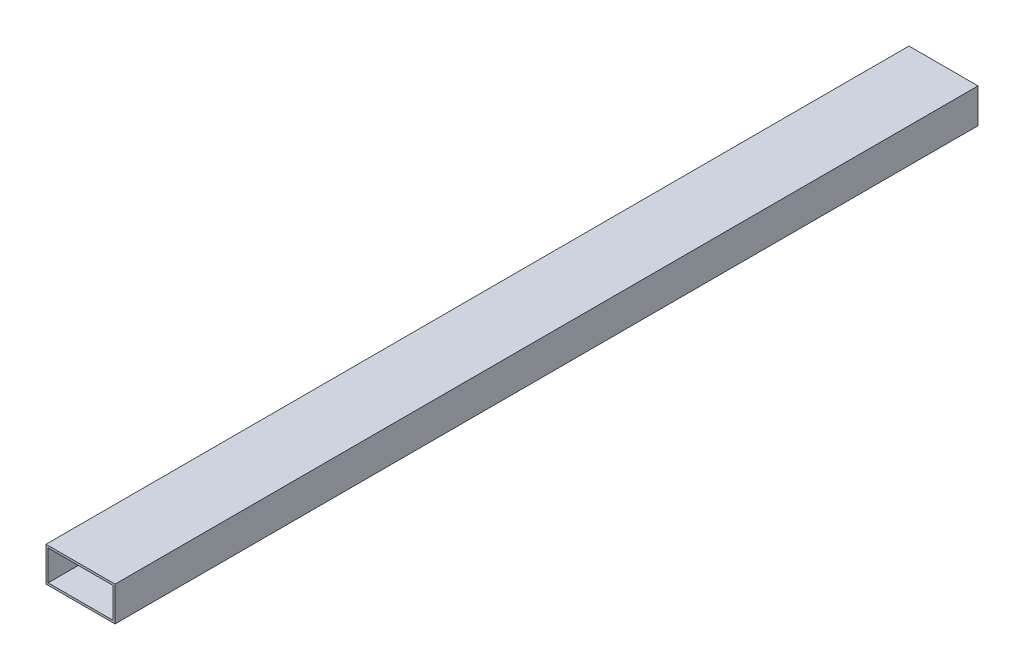
ISO-10303-21;
HEADER;
FILE_DESCRIPTION(('STEP AP214'),'2;1');
FILE_NAME('part.step','',(''),(''),'','','');
FILE_SCHEMA(('AUTOMOTIVE_DESIGN { 1 0 10303 214 1 1 1 1 }'));
ENDSEC;
DATA;
#1=APPLICATION_CONTEXT('core data for automotive mechanical design processes');
#2=APPLICATION_PROTOCOL_DEFINITION('international standard','automotive_design',2000,#1);
#3=PRODUCT_CONTEXT('',#1,'mechanical');
#4=PRODUCT('Part','Part','',(#3));
#5=PRODUCT_RELATED_PRODUCT_CATEGORY('part','',(#4));
#6=PRODUCT_DEFINITION_FORMATION('','',#4);
#7=PRODUCT_DEFINITION_CONTEXT('part definition',#1,'design');
#8=PRODUCT_DEFINITION('design','',#6,#7);
#9=PRODUCT_DEFINITION_SHAPE('','',#8);
#10=(LENGTH_UNIT() NAMED_UNIT(*) SI_UNIT(.MILLI.,.METRE.));
#11=(NAMED_UNIT(*) PLANE_ANGLE_UNIT() SI_UNIT($,.RADIAN.));
#12=(NAMED_UNIT(*) SI_UNIT($,.STERADIAN.) SOLID_ANGLE_UNIT());
#13=UNCERTAINTY_MEASURE_WITH_UNIT(LENGTH_MEASURE(1.E-05),#10,'distance_accuracy_value','');
#14=(GEOMETRIC_REPRESENTATION_CONTEXT(3) GLOBAL_UNCERTAINTY_ASSIGNED_CONTEXT((#13)) GLOBAL_UNIT_ASSIGNED_CONTEXT((#10,
#11,#12)) REPRESENTATION_CONTEXT('',''));
#15=CARTESIAN_POINT('',(0.,0.,0.));
#16=DIRECTION('',(0.,0.,1.));
#17=DIRECTION('',(1.,0.,0.));
#18=AXIS2_PLACEMENT_3D('',#15,#16,#17);
#19=CARTESIAN_POINT('',(0.,0.,317.499999492));
#20=DIRECTION('',(0.,0.,1.));
#21=DIRECTION('',(1.,0.,0.));
#22=AXIS2_PLACEMENT_3D('',#19,#20,#21);
#23=PLANE('',#22);
#24=DIRECTION('',(0.,-1.,0.));
#25=VECTOR('',#24,1.);
#26=CARTESIAN_POINT('',(-25.4,12.7,317.499999492));
#27=LINE('',#26,#25);
#28=CARTESIAN_POINT('',(-25.4,12.7,317.499999492));
#29=VERTEX_POINT('',#28);
#30=CARTESIAN_POINT('',(-25.4,-12.7,317.499999492));
#31=VERTEX_POINT('',#30);
#32=EDGE_CURVE('E113',#29,#31,#27,.T.);
#33=ORIENTED_EDGE('',*,*,#32,.T.);
#34=DIRECTION('',(1.,0.,0.));
#35=VECTOR('',#34,1.);
#36=CARTESIAN_POINT('',(-25.4,-12.7,317.499999492));
#37=LINE('',#36,#35);
#38=CARTESIAN_POINT('',(25.4,-12.7,317.499999492));
#39=VERTEX_POINT('',#38);
#40=EDGE_CURVE('E156',#31,#39,#37,.T.);
#41=ORIENTED_EDGE('',*,*,#40,.T.);
#42=DIRECTION('',(0.,1.,0.));
#43=VECTOR('',#42,1.);
#44=CARTESIAN_POINT('',(25.4,-12.7,317.499999492));
#45=LINE('',#44,#43);
#46=CARTESIAN_POINT('',(25.4,12.7,317.499999492));
#47=VERTEX_POINT('',#46);
#48=EDGE_CURVE('E158',#39,#47,#45,.T.);
#49=ORIENTED_EDGE('',*,*,#48,.T.);
#50=DIRECTION('',(-1.,0.,0.));
#51=VECTOR('',#50,1.);
#52=CARTESIAN_POINT('',(25.4,12.7,317.499999492));
#53=LINE('',#52,#51);
#54=EDGE_CURVE('E60',#47,#29,#53,.T.);
#55=ORIENTED_EDGE('',*,*,#54,.T.);
#56=EDGE_LOOP('',(#33,#41,#49,#55));
#57=FACE_BOUND('',#56,.T.);
#58=DIRECTION('',(1.,0.,0.));
#59=VECTOR('',#58,1.);
#60=CARTESIAN_POINT('',(-23.8125,-11.1125,317.499999492));
#61=LINE('',#60,#59);
#62=CARTESIAN_POINT('',(-23.8125,-11.1125,317.499999492));
#63=VERTEX_POINT('',#62);
#64=CARTESIAN_POINT('',(23.8125,-11.1125,317.499999492));
#65=VERTEX_POINT('',#64);
#66=EDGE_CURVE('E145',#63,#65,#61,.T.);
#67=ORIENTED_EDGE('',*,*,#66,.F.);
#68=DIRECTION('',(0.,-1.,0.));
#69=VECTOR('',#68,1.);
#70=CARTESIAN_POINT('',(-23.8125,11.1125,317.499999492));
#71=LINE('',#70,#69);
#72=CARTESIAN_POINT('',(-23.8125,11.1125,317.499999492));
#73=VERTEX_POINT('',#72);
#74=EDGE_CURVE('E110',#73,#63,#71,.T.);
#75=ORIENTED_EDGE('',*,*,#74,.F.);
#76=DIRECTION('',(-1.,0.,0.));
#77=VECTOR('',#76,1.);
#78=CARTESIAN_POINT('',(23.8125,11.1125,317.499999492));
#79=LINE('',#78,#77);
#80=CARTESIAN_POINT('',(23.8125,11.1125,317.499999492));
#81=VERTEX_POINT('',#80);
#82=EDGE_CURVE('E149',#81,#73,#79,.T.);
#83=ORIENTED_EDGE('',*,*,#82,.F.);
#84=DIRECTION('',(0.,1.,0.));
#85=VECTOR('',#84,1.);
#86=CARTESIAN_POINT('',(23.8125,-11.1125,317.499999492));
#87=LINE('',#86,#85);
#88=EDGE_CURVE('E147',#65,#81,#87,.T.);
#89=ORIENTED_EDGE('',*,*,#88,.F.);
#90=EDGE_LOOP('',(#67,#75,#83,#89));
#91=FACE_BOUND('',#90,.T.);
#92=ADVANCED_FACE('F37',(#57,#91),#23,.T.);
#93=CARTESIAN_POINT('',(-25.4,12.7,317.499999492));
#94=DIRECTION('',(1.,0.,0.));
#95=DIRECTION('',(0.,0.,-1.));
#96=AXIS2_PLACEMENT_3D('',#93,#94,#95);
#97=PLANE('',#96);
#98=DIRECTION('',(0.,0.,-1.));
#99=VECTOR('',#98,1.);
#100=CARTESIAN_POINT('',(-25.4,12.7,317.499999492));
#101=LINE('',#100,#99);
#102=CARTESIAN_POINT('',(-25.4,12.7,-317.499999492));
#103=VERTEX_POINT('',#102);
#104=EDGE_CURVE('E161',#29,#103,#101,.T.);
#105=ORIENTED_EDGE('',*,*,#104,.T.);
#106=DIRECTION('',(0.,-1.,0.));
#107=VECTOR('',#106,1.);
#108=CARTESIAN_POINT('',(-25.4,12.7,-317.499999492));
#109=LINE('',#108,#107);
#110=CARTESIAN_POINT('',(-25.4,-12.7,-317.499999492));
#111=VERTEX_POINT('',#110);
#112=EDGE_CURVE('E132',#103,#111,#109,.T.);
#113=ORIENTED_EDGE('',*,*,#112,.T.);
#114=DIRECTION('',(0.,0.,-1.));
#115=VECTOR('',#114,1.);
#116=CARTESIAN_POINT('',(-25.4,-12.7,317.499999492));
#117=LINE('',#116,#115);
#118=EDGE_CURVE('E11',#31,#111,#117,.T.);
#119=ORIENTED_EDGE('',*,*,#118,.F.);
#120=ORIENTED_EDGE('',*,*,#32,.F.);
#121=EDGE_LOOP('',(#105,#113,#119,#120));
#122=FACE_BOUND('',#121,.T.);
#123=ADVANCED_FACE('F39',(#122),#97,.F.);
#124=CARTESIAN_POINT('',(-25.4,-12.7,317.499999492));
#125=DIRECTION('',(0.,1.,0.));
#126=DIRECTION('',(-1.,0.,0.));
#127=AXIS2_PLACEMENT_3D('',#124,#125,#126);
#128=PLANE('',#127);
#129=ORIENTED_EDGE('',*,*,#118,.T.);
#130=DIRECTION('',(1.,0.,0.));
#131=VECTOR('',#130,1.);
#132=CARTESIAN_POINT('',(-25.4,-12.7,-317.499999492));
#133=LINE('',#132,#131);
#134=CARTESIAN_POINT('',(25.4,-12.7,-317.499999492));
#135=VERTEX_POINT('',#134);
#136=EDGE_CURVE('E135',#111,#135,#133,.T.);
#137=ORIENTED_EDGE('',*,*,#136,.T.);
#138=DIRECTION('',(0.,0.,-1.));
#139=VECTOR('',#138,1.);
#140=CARTESIAN_POINT('',(25.4,-12.7,317.499999492));
#141=LINE('',#140,#139);
#142=EDGE_CURVE('E45',#39,#135,#141,.T.);
#143=ORIENTED_EDGE('',*,*,#142,.F.);
#144=ORIENTED_EDGE('',*,*,#40,.F.);
#145=EDGE_LOOP('',(#129,#137,#143,#144));
#146=FACE_BOUND('',#145,.T.);
#147=ADVANCED_FACE('F174',(#146),#128,.F.);
#148=CARTESIAN_POINT('',(25.4,-12.7,317.499999492));
#149=DIRECTION('',(-1.,0.,0.));
#150=DIRECTION('',(0.,0.,1.));
#151=AXIS2_PLACEMENT_3D('',#148,#149,#150);
#152=PLANE('',#151);
#153=ORIENTED_EDGE('',*,*,#142,.T.);
#154=DIRECTION('',(0.,1.,0.));
#155=VECTOR('',#154,1.);
#156=CARTESIAN_POINT('',(25.4,-12.7,-317.499999492));
#157=LINE('',#156,#155);
#158=CARTESIAN_POINT('',(25.4,12.7,-317.499999492));
#159=VERTEX_POINT('',#158);
#160=EDGE_CURVE('E138',#135,#159,#157,.T.);
#161=ORIENTED_EDGE('',*,*,#160,.T.);
#162=DIRECTION('',(0.,0.,-1.));
#163=VECTOR('',#162,1.);
#164=CARTESIAN_POINT('',(25.4,12.7,317.499999492));
#165=LINE('',#164,#163);
#166=EDGE_CURVE('E163',#47,#159,#165,.T.);
#167=ORIENTED_EDGE('',*,*,#166,.F.);
#168=ORIENTED_EDGE('',*,*,#48,.F.);
#169=EDGE_LOOP('',(#153,#161,#167,#168));
#170=FACE_BOUND('',#169,.T.);
#171=ADVANCED_FACE('F168',(#170),#152,.F.);
#172=CARTESIAN_POINT('',(25.4,12.7,317.499999492));
#173=DIRECTION('',(0.,-1.,0.));
#174=DIRECTION('',(1.,0.,0.));
#175=AXIS2_PLACEMENT_3D('',#172,#173,#174);
#176=PLANE('',#175);
#177=ORIENTED_EDGE('',*,*,#166,.T.);
#178=DIRECTION('',(-1.,0.,0.));
#179=VECTOR('',#178,1.);
#180=CARTESIAN_POINT('',(25.4,12.7,-317.499999492));
#181=LINE('',#180,#179);
#182=EDGE_CURVE('E141',#159,#103,#181,.T.);
#183=ORIENTED_EDGE('',*,*,#182,.T.);
#184=ORIENTED_EDGE('',*,*,#104,.F.);
#185=ORIENTED_EDGE('',*,*,#54,.F.);
#186=EDGE_LOOP('',(#177,#183,#184,#185));
#187=FACE_BOUND('',#186,.T.);
#188=ADVANCED_FACE('F179',(#187),#176,.F.);
#189=CARTESIAN_POINT('',(-23.8125,11.1125,317.499999492));
#190=DIRECTION('',(1.,0.,0.));
#191=DIRECTION('',(0.,1.,0.));
#192=AXIS2_PLACEMENT_3D('',#189,#190,#191);
#193=PLANE('',#192);
#194=DIRECTION('',(0.,0.,-1.));
#195=VECTOR('',#194,1.);
#196=CARTESIAN_POINT('',(-23.8125,-11.1125,317.499999492));
#197=LINE('',#196,#195);
#198=CARTESIAN_POINT('',(-23.8125,-11.1125,-317.499999492));
#199=VERTEX_POINT('',#198);
#200=EDGE_CURVE('E102',#63,#199,#197,.T.);
#201=ORIENTED_EDGE('',*,*,#200,.T.);
#202=DIRECTION('',(0.,-1.,0.));
#203=VECTOR('',#202,1.);
#204=CARTESIAN_POINT('',(-23.8125,11.1125,-317.499999492));
#205=LINE('',#204,#203);
#206=CARTESIAN_POINT('',(-23.8125,11.1125,-317.499999492));
#207=VERTEX_POINT('',#206);
#208=EDGE_CURVE('E107',#207,#199,#205,.T.);
#209=ORIENTED_EDGE('',*,*,#208,.F.);
#210=DIRECTION('',(0.,0.,-1.));
#211=VECTOR('',#210,1.);
#212=CARTESIAN_POINT('',(-23.8125,11.1125,317.499999492));
#213=LINE('',#212,#211);
#214=EDGE_CURVE('E151',#73,#207,#213,.T.);
#215=ORIENTED_EDGE('',*,*,#214,.F.);
#216=ORIENTED_EDGE('',*,*,#74,.T.);
#217=EDGE_LOOP('',(#201,#209,#215,#216));
#218=FACE_BOUND('',#217,.T.);
#219=ADVANCED_FACE('F104',(#218),#193,.T.);
#220=CARTESIAN_POINT('',(-23.8125,-11.1125,317.499999492));
#221=DIRECTION('',(0.,1.,0.));
#222=DIRECTION('',(0.,0.,1.));
#223=AXIS2_PLACEMENT_3D('',#220,#221,#222);
#224=PLANE('',#223);
#225=DIRECTION('',(0.,0.,-1.));
#226=VECTOR('',#225,1.);
#227=CARTESIAN_POINT('',(23.8125,-11.1125,317.499999492));
#228=LINE('',#227,#226);
#229=CARTESIAN_POINT('',(23.8125,-11.1125,-317.499999492));
#230=VERTEX_POINT('',#229);
#231=EDGE_CURVE('E114',#65,#230,#228,.T.);
#232=ORIENTED_EDGE('',*,*,#231,.T.);
#233=DIRECTION('',(1.,0.,0.));
#234=VECTOR('',#233,1.);
#235=CARTESIAN_POINT('',(-23.8125,-11.1125,-317.499999492));
#236=LINE('',#235,#234);
#237=EDGE_CURVE('E117',#199,#230,#236,.T.);
#238=ORIENTED_EDGE('',*,*,#237,.F.);
#239=ORIENTED_EDGE('',*,*,#200,.F.);
#240=ORIENTED_EDGE('',*,*,#66,.T.);
#241=EDGE_LOOP('',(#232,#238,#239,#240));
#242=FACE_BOUND('',#241,.T.);
#243=ADVANCED_FACE('F118',(#242),#224,.T.);
#244=CARTESIAN_POINT('',(23.8125,-11.1125,317.499999492));
#245=DIRECTION('',(-1.,0.,0.));
#246=DIRECTION('',(0.,0.,1.));
#247=AXIS2_PLACEMENT_3D('',#244,#245,#246);
#248=PLANE('',#247);
#249=DIRECTION('',(0.,0.,-1.));
#250=VECTOR('',#249,1.);
#251=CARTESIAN_POINT('',(23.8125,11.1125,317.499999492));
#252=LINE('',#251,#250);
#253=CARTESIAN_POINT('',(23.8125,11.1125,-317.499999492));
#254=VERTEX_POINT('',#253);
#255=EDGE_CURVE('E52',#81,#254,#252,.T.);
#256=ORIENTED_EDGE('',*,*,#255,.T.);
#257=DIRECTION('',(0.,1.,0.));
#258=VECTOR('',#257,1.);
#259=CARTESIAN_POINT('',(23.8125,-11.1125,-317.499999492));
#260=LINE('',#259,#258);
#261=EDGE_CURVE('E123',#230,#254,#260,.T.);
#262=ORIENTED_EDGE('',*,*,#261,.F.);
#263=ORIENTED_EDGE('',*,*,#231,.F.);
#264=ORIENTED_EDGE('',*,*,#88,.T.);
#265=EDGE_LOOP('',(#256,#262,#263,#264));
#266=FACE_BOUND('',#265,.T.);
#267=ADVANCED_FACE('F197',(#266),#248,.T.);
#268=CARTESIAN_POINT('',(23.8125,11.1125,317.499999492));
#269=DIRECTION('',(0.,-1.,0.));
#270=DIRECTION('',(0.,0.,-1.));
#271=AXIS2_PLACEMENT_3D('',#268,#269,#270);
#272=PLANE('',#271);
#273=ORIENTED_EDGE('',*,*,#214,.T.);
#274=DIRECTION('',(-1.,0.,0.));
#275=VECTOR('',#274,1.);
#276=CARTESIAN_POINT('',(23.8125,11.1125,-317.499999492));
#277=LINE('',#276,#275);
#278=EDGE_CURVE('E127',#254,#207,#277,.T.);
#279=ORIENTED_EDGE('',*,*,#278,.F.);
#280=ORIENTED_EDGE('',*,*,#255,.F.);
#281=ORIENTED_EDGE('',*,*,#82,.T.);
#282=EDGE_LOOP('',(#273,#279,#280,#281));
#283=FACE_BOUND('',#282,.T.);
#284=ADVANCED_FACE('F200',(#283),#272,.T.);
#285=CARTESIAN_POINT('',(0.,0.,-317.499999492));
#286=DIRECTION('',(0.,0.,1.));
#287=DIRECTION('',(1.,0.,0.));
#288=AXIS2_PLACEMENT_3D('',#285,#286,#287);
#289=PLANE('',#288);
#290=ORIENTED_EDGE('',*,*,#278,.T.);
#291=ORIENTED_EDGE('',*,*,#208,.T.);
#292=ORIENTED_EDGE('',*,*,#237,.T.);
#293=ORIENTED_EDGE('',*,*,#261,.T.);
#294=EDGE_LOOP('',(#290,#291,#292,#293));
#295=FACE_BOUND('',#294,.T.);
#296=ORIENTED_EDGE('',*,*,#112,.F.);
#297=ORIENTED_EDGE('',*,*,#182,.F.);
#298=ORIENTED_EDGE('',*,*,#160,.F.);
#299=ORIENTED_EDGE('',*,*,#136,.F.);
#300=EDGE_LOOP('',(#296,#297,#298,#299));
#301=FACE_BOUND('',#300,.T.);
#302=ADVANCED_FACE('F125',(#295,#301),#289,.F.);
#303=CLOSED_SHELL('',(#92,#123,#147,#171,#188,#219,#243,#267,#284,#302));
#304=MANIFOLD_SOLID_BREP('B2',#303);
#305=ADVANCED_BREP_SHAPE_REPRESENTATION('',(#18,#304),#14);
#306=SHAPE_DEFINITION_REPRESENTATION(#9,#305);
ENDSEC;
END-ISO-10303-21;
